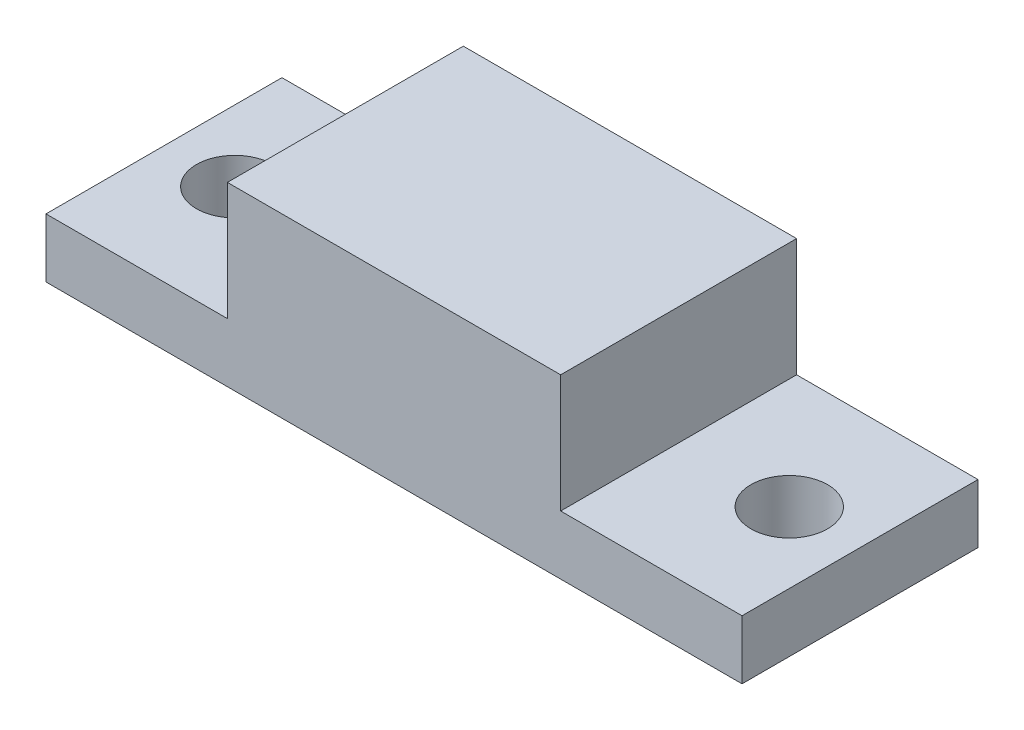
ISO-10303-21;
HEADER;
FILE_DESCRIPTION(('STEP AP214'),'2;1');
FILE_NAME('part.step','',(''),(''),'','','');
FILE_SCHEMA(('AUTOMOTIVE_DESIGN { 1 0 10303 214 1 1 1 1 }'));
ENDSEC;
DATA;
#1=APPLICATION_CONTEXT('core data for automotive mechanical design processes');
#2=APPLICATION_PROTOCOL_DEFINITION('international standard','automotive_design',2000,#1);
#3=PRODUCT_CONTEXT('',#1,'mechanical');
#4=PRODUCT('Part','Part','',(#3));
#5=PRODUCT_RELATED_PRODUCT_CATEGORY('part','',(#4));
#6=PRODUCT_DEFINITION_FORMATION('','',#4);
#7=PRODUCT_DEFINITION_CONTEXT('part definition',#1,'design');
#8=PRODUCT_DEFINITION('design','',#6,#7);
#9=PRODUCT_DEFINITION_SHAPE('','',#8);
#10=(LENGTH_UNIT() NAMED_UNIT(*) SI_UNIT(.MILLI.,.METRE.));
#11=(NAMED_UNIT(*) PLANE_ANGLE_UNIT() SI_UNIT($,.RADIAN.));
#12=(NAMED_UNIT(*) SI_UNIT($,.STERADIAN.) SOLID_ANGLE_UNIT());
#13=UNCERTAINTY_MEASURE_WITH_UNIT(LENGTH_MEASURE(1.E-05),#10,'distance_accuracy_value','');
#14=(GEOMETRIC_REPRESENTATION_CONTEXT(3) GLOBAL_UNCERTAINTY_ASSIGNED_CONTEXT((#13)) GLOBAL_UNIT_ASSIGNED_CONTEXT((#10,
#11,#12)) REPRESENTATION_CONTEXT('',''));
#15=CARTESIAN_POINT('',(0.,0.,0.));
#16=DIRECTION('',(0.,0.,1.));
#17=DIRECTION('',(1.,0.,0.));
#18=AXIS2_PLACEMENT_3D('',#15,#16,#17);
#19=CARTESIAN_POINT('',(-5.65,-4.,8.));
#20=DIRECTION('',(1.,0.,0.));
#21=DIRECTION('',(0.,0.,-1.));
#22=AXIS2_PLACEMENT_3D('',#19,#20,#21);
#23=PLANE('',#22);
#24=DIRECTION('',(0.,-1.,0.));
#25=VECTOR('',#24,1.);
#26=CARTESIAN_POINT('',(-5.65,-4.,0.));
#27=LINE('',#26,#25);
#28=CARTESIAN_POINT('',(-5.65,0.,0.));
#29=VERTEX_POINT('',#28);
#30=CARTESIAN_POINT('',(-5.65,-4.,0.));
#31=VERTEX_POINT('',#30);
#32=EDGE_CURVE('E131',#29,#31,#27,.T.);
#33=ORIENTED_EDGE('',*,*,#32,.T.);
#34=DIRECTION('',(0.,0.,-1.));
#35=VECTOR('',#34,1.);
#36=CARTESIAN_POINT('',(-5.65,-4.,8.));
#37=LINE('',#36,#35);
#38=CARTESIAN_POINT('',(-5.65,-4.,8.));
#39=VERTEX_POINT('',#38);
#40=EDGE_CURVE('E11',#39,#31,#37,.T.);
#41=ORIENTED_EDGE('',*,*,#40,.F.);
#42=DIRECTION('',(0.,-1.,0.));
#43=VECTOR('',#42,1.);
#44=CARTESIAN_POINT('',(-5.65,-4.,8.));
#45=LINE('',#44,#43);
#46=CARTESIAN_POINT('',(-5.65,0.,8.));
#47=VERTEX_POINT('',#46);
#48=EDGE_CURVE('E146',#47,#39,#45,.T.);
#49=ORIENTED_EDGE('',*,*,#48,.F.);
#50=DIRECTION('',(0.,0.,-1.));
#51=VECTOR('',#50,1.);
#52=CARTESIAN_POINT('',(-5.65,0.,8.));
#53=LINE('',#52,#51);
#54=EDGE_CURVE('E127',#47,#29,#53,.T.);
#55=ORIENTED_EDGE('',*,*,#54,.T.);
#56=EDGE_LOOP('',(#33,#41,#49,#55));
#57=FACE_BOUND('',#56,.T.);
#58=ADVANCED_FACE('F35',(#57),#23,.F.);
#59=CARTESIAN_POINT('',(-11.8,-4.,8.));
#60=DIRECTION('',(0.,-1.,0.));
#61=DIRECTION('',(0.,0.,-1.));
#62=AXIS2_PLACEMENT_3D('',#59,#60,#61);
#63=PLANE('',#62);
#64=CARTESIAN_POINT('',(-9.4,-4.,4.));
#65=DIRECTION('',(0.,-1.,0.));
#66=DIRECTION('',(0.,0.,-1.));
#67=AXIS2_PLACEMENT_3D('',#64,#65,#66);
#68=CIRCLE('',#67,1.3);
#69=CARTESIAN_POINT('',(-9.4,-4.,2.7));
#70=VERTEX_POINT('',#69);
#71=EDGE_CURVE('E135',#70,#70,#68,.F.);
#72=ORIENTED_EDGE('',*,*,#71,.F.);
#73=EDGE_LOOP('',(#72));
#74=FACE_BOUND('',#73,.T.);
#75=DIRECTION('',(-1.,0.,0.));
#76=VECTOR('',#75,1.);
#77=CARTESIAN_POINT('',(-11.8,-4.,0.));
#78=LINE('',#77,#76);
#79=CARTESIAN_POINT('',(-11.8,-4.,0.));
#80=VERTEX_POINT('',#79);
#81=EDGE_CURVE('E134',#31,#80,#78,.T.);
#82=ORIENTED_EDGE('',*,*,#81,.T.);
#83=DIRECTION('',(0.,0.,-1.));
#84=VECTOR('',#83,1.);
#85=CARTESIAN_POINT('',(-11.8,-4.,8.));
#86=LINE('',#85,#84);
#87=CARTESIAN_POINT('',(-11.8,-4.,8.));
#88=VERTEX_POINT('',#87);
#89=EDGE_CURVE('E43',#88,#80,#86,.T.);
#90=ORIENTED_EDGE('',*,*,#89,.F.);
#91=DIRECTION('',(-1.,0.,0.));
#92=VECTOR('',#91,1.);
#93=CARTESIAN_POINT('',(-11.8,-4.,8.));
#94=LINE('',#93,#92);
#95=EDGE_CURVE('E94',#39,#88,#94,.T.);
#96=ORIENTED_EDGE('',*,*,#95,.F.);
#97=ORIENTED_EDGE('',*,*,#40,.T.);
#98=EDGE_LOOP('',(#82,#90,#96,#97));
#99=FACE_BOUND('',#98,.T.);
#100=ADVANCED_FACE('F215',(#74,#99),#63,.F.);
#101=CARTESIAN_POINT('',(-11.8,-6.,8.));
#102=DIRECTION('',(1.,0.,0.));
#103=DIRECTION('',(0.,0.,-1.));
#104=AXIS2_PLACEMENT_3D('',#101,#102,#103);
#105=PLANE('',#104);
#106=DIRECTION('',(0.,-1.,0.));
#107=VECTOR('',#106,1.);
#108=CARTESIAN_POINT('',(-11.8,-6.,0.));
#109=LINE('',#108,#107);
#110=CARTESIAN_POINT('',(-11.8,-6.,0.));
#111=VERTEX_POINT('',#110);
#112=EDGE_CURVE('E137',#80,#111,#109,.T.);
#113=ORIENTED_EDGE('',*,*,#112,.T.);
#114=DIRECTION('',(0.,0.,-1.));
#115=VECTOR('',#114,1.);
#116=CARTESIAN_POINT('',(-11.8,-6.,8.));
#117=LINE('',#116,#115);
#118=CARTESIAN_POINT('',(-11.8,-6.,8.));
#119=VERTEX_POINT('',#118);
#120=EDGE_CURVE('E153',#119,#111,#117,.T.);
#121=ORIENTED_EDGE('',*,*,#120,.F.);
#122=DIRECTION('',(0.,-1.,0.));
#123=VECTOR('',#122,1.);
#124=CARTESIAN_POINT('',(-11.8,-6.,8.));
#125=LINE('',#124,#123);
#126=EDGE_CURVE('E161',#88,#119,#125,.T.);
#127=ORIENTED_EDGE('',*,*,#126,.F.);
#128=ORIENTED_EDGE('',*,*,#89,.T.);
#129=EDGE_LOOP('',(#113,#121,#127,#128));
#130=FACE_BOUND('',#129,.T.);
#131=ADVANCED_FACE('F159',(#130),#105,.F.);
#132=CARTESIAN_POINT('',(11.8,-6.,8.));
#133=DIRECTION('',(0.,1.,0.));
#134=DIRECTION('',(0.,0.,1.));
#135=AXIS2_PLACEMENT_3D('',#132,#133,#134);
#136=PLANE('',#135);
#137=CARTESIAN_POINT('',(-9.4,-6.,4.));
#138=DIRECTION('',(0.,-1.,0.));
#139=DIRECTION('',(0.,0.,-1.));
#140=AXIS2_PLACEMENT_3D('',#137,#138,#139);
#141=CIRCLE('',#140,1.3);
#142=CARTESIAN_POINT('',(-9.4,-6.,2.7));
#143=VERTEX_POINT('',#142);
#144=EDGE_CURVE('E182',#143,#143,#141,.T.);
#145=ORIENTED_EDGE('',*,*,#144,.F.);
#146=EDGE_LOOP('',(#145));
#147=FACE_BOUND('',#146,.T.);
#148=CARTESIAN_POINT('',(9.4,-6.,4.));
#149=DIRECTION('',(0.,-1.,0.));
#150=DIRECTION('',(0.,0.,-1.));
#151=AXIS2_PLACEMENT_3D('',#148,#149,#150);
#152=CIRCLE('',#151,1.3);
#153=CARTESIAN_POINT('',(9.4,-6.,2.7));
#154=VERTEX_POINT('',#153);
#155=EDGE_CURVE('E183',#154,#154,#152,.T.);
#156=ORIENTED_EDGE('',*,*,#155,.F.);
#157=EDGE_LOOP('',(#156));
#158=FACE_BOUND('',#157,.T.);
#159=DIRECTION('',(1.,0.,0.));
#160=VECTOR('',#159,1.);
#161=CARTESIAN_POINT('',(11.8,-6.,0.));
#162=LINE('',#161,#160);
#163=CARTESIAN_POINT('',(11.8,-6.,0.));
#164=VERTEX_POINT('',#163);
#165=EDGE_CURVE('E139',#111,#164,#162,.T.);
#166=ORIENTED_EDGE('',*,*,#165,.T.);
#167=DIRECTION('',(0.,0.,-1.));
#168=VECTOR('',#167,1.);
#169=CARTESIAN_POINT('',(11.8,-6.,8.));
#170=LINE('',#169,#168);
#171=CARTESIAN_POINT('',(11.8,-6.,8.));
#172=VERTEX_POINT('',#171);
#173=EDGE_CURVE('E150',#172,#164,#170,.T.);
#174=ORIENTED_EDGE('',*,*,#173,.F.);
#175=DIRECTION('',(1.,0.,0.));
#176=VECTOR('',#175,1.);
#177=CARTESIAN_POINT('',(11.8,-6.,8.));
#178=LINE('',#177,#176);
#179=EDGE_CURVE('E173',#119,#172,#178,.T.);
#180=ORIENTED_EDGE('',*,*,#179,.F.);
#181=ORIENTED_EDGE('',*,*,#120,.T.);
#182=EDGE_LOOP('',(#166,#174,#180,#181));
#183=FACE_BOUND('',#182,.T.);
#184=ADVANCED_FACE('F169',(#147,#158,#183),#136,.F.);
#185=CARTESIAN_POINT('',(11.8,-4.,8.));
#186=DIRECTION('',(-1.,0.,0.));
#187=DIRECTION('',(0.,0.,1.));
#188=AXIS2_PLACEMENT_3D('',#185,#186,#187);
#189=PLANE('',#188);
#190=DIRECTION('',(0.,1.,0.));
#191=VECTOR('',#190,1.);
#192=CARTESIAN_POINT('',(11.8,-4.,0.));
#193=LINE('',#192,#191);
#194=CARTESIAN_POINT('',(11.8,-4.,0.));
#195=VERTEX_POINT('',#194);
#196=EDGE_CURVE('E141',#164,#195,#193,.T.);
#197=ORIENTED_EDGE('',*,*,#196,.T.);
#198=DIRECTION('',(0.,0.,-1.));
#199=VECTOR('',#198,1.);
#200=CARTESIAN_POINT('',(11.8,-4.,8.));
#201=LINE('',#200,#199);
#202=CARTESIAN_POINT('',(11.8,-4.,8.));
#203=VERTEX_POINT('',#202);
#204=EDGE_CURVE('E122',#203,#195,#201,.T.);
#205=ORIENTED_EDGE('',*,*,#204,.F.);
#206=DIRECTION('',(0.,1.,0.));
#207=VECTOR('',#206,1.);
#208=CARTESIAN_POINT('',(11.8,-4.,8.));
#209=LINE('',#208,#207);
#210=EDGE_CURVE('E113',#172,#203,#209,.T.);
#211=ORIENTED_EDGE('',*,*,#210,.F.);
#212=ORIENTED_EDGE('',*,*,#173,.T.);
#213=EDGE_LOOP('',(#197,#205,#211,#212));
#214=FACE_BOUND('',#213,.T.);
#215=ADVANCED_FACE('F172',(#214),#189,.F.);
#216=CARTESIAN_POINT('',(5.65,-4.,8.));
#217=DIRECTION('',(0.,-1.,0.));
#218=DIRECTION('',(0.,0.,-1.));
#219=AXIS2_PLACEMENT_3D('',#216,#217,#218);
#220=PLANE('',#219);
#221=CARTESIAN_POINT('',(9.4,-4.,4.));
#222=DIRECTION('',(0.,-1.,0.));
#223=DIRECTION('',(0.,0.,-1.));
#224=AXIS2_PLACEMENT_3D('',#221,#222,#223);
#225=CIRCLE('',#224,1.3);
#226=CARTESIAN_POINT('',(9.4,-4.,2.7));
#227=VERTEX_POINT('',#226);
#228=EDGE_CURVE('E179',#227,#227,#225,.F.);
#229=ORIENTED_EDGE('',*,*,#228,.F.);
#230=EDGE_LOOP('',(#229));
#231=FACE_BOUND('',#230,.T.);
#232=DIRECTION('',(-1.,0.,0.));
#233=VECTOR('',#232,1.);
#234=CARTESIAN_POINT('',(5.65,-4.,0.));
#235=LINE('',#234,#233);
#236=CARTESIAN_POINT('',(5.65,-4.,0.));
#237=VERTEX_POINT('',#236);
#238=EDGE_CURVE('E121',#195,#237,#235,.T.);
#239=ORIENTED_EDGE('',*,*,#238,.T.);
#240=DIRECTION('',(0.,0.,-1.));
#241=VECTOR('',#240,1.);
#242=CARTESIAN_POINT('',(5.65,-4.,8.));
#243=LINE('',#242,#241);
#244=CARTESIAN_POINT('',(5.65,-4.,8.));
#245=VERTEX_POINT('',#244);
#246=EDGE_CURVE('E118',#245,#237,#243,.T.);
#247=ORIENTED_EDGE('',*,*,#246,.F.);
#248=DIRECTION('',(-1.,0.,0.));
#249=VECTOR('',#248,1.);
#250=CARTESIAN_POINT('',(5.65,-4.,8.));
#251=LINE('',#250,#249);
#252=EDGE_CURVE('E107',#203,#245,#251,.T.);
#253=ORIENTED_EDGE('',*,*,#252,.F.);
#254=ORIENTED_EDGE('',*,*,#204,.T.);
#255=EDGE_LOOP('',(#239,#247,#253,#254));
#256=FACE_BOUND('',#255,.T.);
#257=ADVANCED_FACE('F119',(#231,#256),#220,.F.);
#258=CARTESIAN_POINT('',(5.65,0.,8.));
#259=DIRECTION('',(-1.,0.,0.));
#260=DIRECTION('',(0.,0.,1.));
#261=AXIS2_PLACEMENT_3D('',#258,#259,#260);
#262=PLANE('',#261);
#263=DIRECTION('',(0.,1.,0.));
#264=VECTOR('',#263,1.);
#265=CARTESIAN_POINT('',(5.65,0.,0.));
#266=LINE('',#265,#264);
#267=CARTESIAN_POINT('',(5.65,0.,0.));
#268=VERTEX_POINT('',#267);
#269=EDGE_CURVE('E80',#237,#268,#266,.T.);
#270=ORIENTED_EDGE('',*,*,#269,.T.);
#271=DIRECTION('',(0.,0.,-1.));
#272=VECTOR('',#271,1.);
#273=CARTESIAN_POINT('',(5.65,0.,8.));
#274=LINE('',#273,#272);
#275=CARTESIAN_POINT('',(5.65,0.,8.));
#276=VERTEX_POINT('',#275);
#277=EDGE_CURVE('E123',#276,#268,#274,.T.);
#278=ORIENTED_EDGE('',*,*,#277,.F.);
#279=DIRECTION('',(0.,1.,0.));
#280=VECTOR('',#279,1.);
#281=CARTESIAN_POINT('',(5.65,0.,8.));
#282=LINE('',#281,#280);
#283=EDGE_CURVE('E111',#245,#276,#282,.T.);
#284=ORIENTED_EDGE('',*,*,#283,.F.);
#285=ORIENTED_EDGE('',*,*,#246,.T.);
#286=EDGE_LOOP('',(#270,#278,#284,#285));
#287=FACE_BOUND('',#286,.T.);
#288=ADVANCED_FACE('F125',(#287),#262,.F.);
#289=CARTESIAN_POINT('',(-5.65,0.,8.));
#290=DIRECTION('',(0.,-1.,0.));
#291=DIRECTION('',(0.,0.,-1.));
#292=AXIS2_PLACEMENT_3D('',#289,#290,#291);
#293=PLANE('',#292);
#294=DIRECTION('',(-1.,0.,0.));
#295=VECTOR('',#294,1.);
#296=CARTESIAN_POINT('',(-5.65,0.,0.));
#297=LINE('',#296,#295);
#298=EDGE_CURVE('E86',#268,#29,#297,.T.);
#299=ORIENTED_EDGE('',*,*,#298,.T.);
#300=ORIENTED_EDGE('',*,*,#54,.F.);
#301=DIRECTION('',(-1.,0.,0.));
#302=VECTOR('',#301,1.);
#303=CARTESIAN_POINT('',(-5.65,0.,8.));
#304=LINE('',#303,#302);
#305=EDGE_CURVE('E51',#276,#47,#304,.T.);
#306=ORIENTED_EDGE('',*,*,#305,.F.);
#307=ORIENTED_EDGE('',*,*,#277,.T.);
#308=EDGE_LOOP('',(#299,#300,#306,#307));
#309=FACE_BOUND('',#308,.T.);
#310=ADVANCED_FACE('F211',(#309),#293,.F.);
#311=CARTESIAN_POINT('',(0.,0.,8.));
#312=DIRECTION('',(0.,0.,-1.));
#313=DIRECTION('',(-1.,0.,0.));
#314=AXIS2_PLACEMENT_3D('',#311,#312,#313);
#315=PLANE('',#314);
#316=ORIENTED_EDGE('',*,*,#48,.T.);
#317=ORIENTED_EDGE('',*,*,#95,.T.);
#318=ORIENTED_EDGE('',*,*,#126,.T.);
#319=ORIENTED_EDGE('',*,*,#179,.T.);
#320=ORIENTED_EDGE('',*,*,#210,.T.);
#321=ORIENTED_EDGE('',*,*,#252,.T.);
#322=ORIENTED_EDGE('',*,*,#283,.T.);
#323=ORIENTED_EDGE('',*,*,#305,.T.);
#324=EDGE_LOOP('',(#316,#317,#318,#319,#320,#321,#322,#323));
#325=FACE_BOUND('',#324,.T.);
#326=ADVANCED_FACE('F109',(#325),#315,.F.);
#327=CARTESIAN_POINT('',(0.,0.,0.));
#328=DIRECTION('',(0.,0.,-1.));
#329=DIRECTION('',(-1.,0.,0.));
#330=AXIS2_PLACEMENT_3D('',#327,#328,#329);
#331=PLANE('',#330);
#332=ORIENTED_EDGE('',*,*,#32,.F.);
#333=ORIENTED_EDGE('',*,*,#298,.F.);
#334=ORIENTED_EDGE('',*,*,#269,.F.);
#335=ORIENTED_EDGE('',*,*,#238,.F.);
#336=ORIENTED_EDGE('',*,*,#196,.F.);
#337=ORIENTED_EDGE('',*,*,#165,.F.);
#338=ORIENTED_EDGE('',*,*,#112,.F.);
#339=ORIENTED_EDGE('',*,*,#81,.F.);
#340=EDGE_LOOP('',(#332,#333,#334,#335,#336,#337,#338,#339));
#341=FACE_BOUND('',#340,.T.);
#342=ADVANCED_FACE('F165',(#341),#331,.T.);
#343=CARTESIAN_POINT('',(9.4,0.00100000000000013,4.));
#344=DIRECTION('',(0.,-1.,0.));
#345=DIRECTION('',(0.,0.,-1.));
#346=AXIS2_PLACEMENT_3D('',#343,#344,#345);
#347=CYLINDRICAL_SURFACE('',#346,1.3);
#348=CARTESIAN_POINT('',(9.4,-6.,2.7));
#349=CARTESIAN_POINT('',(9.4,-5.97916666666667,2.7));
#350=CARTESIAN_POINT('',(9.4,-5.95833333333333,2.7));
#351=CARTESIAN_POINT('',(9.4,-5.91666666666667,2.7));
#352=CARTESIAN_POINT('',(9.4,-5.89583333333333,2.7));
#353=CARTESIAN_POINT('',(9.4,-5.85416666666667,2.7));
#354=CARTESIAN_POINT('',(9.4,-5.83333333333333,2.7));
#355=CARTESIAN_POINT('',(9.4,-5.79166666666667,2.7));
#356=CARTESIAN_POINT('',(9.4,-5.77083333333333,2.7));
#357=CARTESIAN_POINT('',(9.4,-5.72916666666667,2.7));
#358=CARTESIAN_POINT('',(9.4,-5.70833333333333,2.7));
#359=CARTESIAN_POINT('',(9.4,-5.66666666666667,2.7));
#360=CARTESIAN_POINT('',(9.4,-5.64583333333333,2.7));
#361=CARTESIAN_POINT('',(9.4,-5.60416666666667,2.7));
#362=CARTESIAN_POINT('',(9.4,-5.58333333333333,2.7));
#363=CARTESIAN_POINT('',(9.4,-5.54166666666667,2.7));
#364=CARTESIAN_POINT('',(9.4,-5.52083333333333,2.7));
#365=CARTESIAN_POINT('',(9.4,-5.47916666666667,2.7));
#366=CARTESIAN_POINT('',(9.4,-5.45833333333333,2.7));
#367=CARTESIAN_POINT('',(9.4,-5.41666666666667,2.7));
#368=CARTESIAN_POINT('',(9.4,-5.39583333333333,2.7));
#369=CARTESIAN_POINT('',(9.4,-5.35416666666667,2.7));
#370=CARTESIAN_POINT('',(9.4,-5.33333333333333,2.7));
#371=CARTESIAN_POINT('',(9.4,-5.29166666666667,2.7));
#372=CARTESIAN_POINT('',(9.4,-5.27083333333333,2.7));
#373=CARTESIAN_POINT('',(9.4,-5.22916666666667,2.7));
#374=CARTESIAN_POINT('',(9.4,-5.20833333333333,2.7));
#375=CARTESIAN_POINT('',(9.4,-5.16666666666667,2.7));
#376=CARTESIAN_POINT('',(9.4,-5.14583333333333,2.7));
#377=CARTESIAN_POINT('',(9.4,-5.10416666666667,2.7));
#378=CARTESIAN_POINT('',(9.4,-5.08333333333333,2.7));
#379=CARTESIAN_POINT('',(9.4,-5.04166666666667,2.7));
#380=CARTESIAN_POINT('',(9.4,-5.02083333333333,2.7));
#381=CARTESIAN_POINT('',(9.4,-4.97916666666667,2.7));
#382=CARTESIAN_POINT('',(9.4,-4.95833333333333,2.7));
#383=CARTESIAN_POINT('',(9.4,-4.91666666666667,2.7));
#384=CARTESIAN_POINT('',(9.4,-4.89583333333333,2.7));
#385=CARTESIAN_POINT('',(9.4,-4.85416666666667,2.7));
#386=CARTESIAN_POINT('',(9.4,-4.83333333333333,2.7));
#387=CARTESIAN_POINT('',(9.4,-4.79166666666667,2.7));
#388=CARTESIAN_POINT('',(9.4,-4.77083333333333,2.7));
#389=CARTESIAN_POINT('',(9.4,-4.72916666666667,2.7));
#390=CARTESIAN_POINT('',(9.4,-4.70833333333333,2.7));
#391=CARTESIAN_POINT('',(9.4,-4.66666666666667,2.7));
#392=CARTESIAN_POINT('',(9.4,-4.64583333333333,2.7));
#393=CARTESIAN_POINT('',(9.4,-4.60416666666667,2.7));
#394=CARTESIAN_POINT('',(9.4,-4.58333333333333,2.7));
#395=CARTESIAN_POINT('',(9.4,-4.54166666666667,2.7));
#396=CARTESIAN_POINT('',(9.4,-4.52083333333333,2.7));
#397=CARTESIAN_POINT('',(9.4,-4.47916666666667,2.7));
#398=CARTESIAN_POINT('',(9.4,-4.45833333333333,2.7));
#399=CARTESIAN_POINT('',(9.4,-4.41666666666667,2.7));
#400=CARTESIAN_POINT('',(9.4,-4.39583333333333,2.7));
#401=CARTESIAN_POINT('',(9.4,-4.35416666666667,2.7));
#402=CARTESIAN_POINT('',(9.4,-4.33333333333333,2.7));
#403=CARTESIAN_POINT('',(9.4,-4.29166666666667,2.7));
#404=CARTESIAN_POINT('',(9.4,-4.27083333333333,2.7));
#405=CARTESIAN_POINT('',(9.4,-4.22916666666667,2.7));
#406=CARTESIAN_POINT('',(9.4,-4.20833333333333,2.7));
#407=CARTESIAN_POINT('',(9.4,-4.16666666666667,2.7));
#408=CARTESIAN_POINT('',(9.4,-4.14583333333333,2.7));
#409=CARTESIAN_POINT('',(9.4,-4.10416666666667,2.7));
#410=CARTESIAN_POINT('',(9.4,-4.08333333333333,2.7));
#411=CARTESIAN_POINT('',(9.4,-4.04166666666667,2.7));
#412=CARTESIAN_POINT('',(9.4,-4.02083333333333,2.7));
#413=CARTESIAN_POINT('',(9.4,-4.,2.7));
#414=B_SPLINE_CURVE_WITH_KNOTS('',3,(#348,#349,#350,#351,#352,#353,#354,#355,#356,#357,#358,
#359,#360,#361,#362,#363,#364,#365,#366,#367,#368,#369,#370,#371,#372,#373,#374,#375,#376,#377,
#378,#379,#380,#381,#382,#383,#384,#385,#386,#387,#388,#389,#390,#391,#392,#393,#394,#395,#396,
#397,#398,#399,#400,#401,#402,#403,#404,#405,#406,#407,#408,#409,#410,#411,#412,#413),
.UNSPECIFIED.,.F.,.F.,(4,2,2,2,2,2,2,2,2,2,2,2,2,2,2,2,2,2,2,2,2,2,2,2,2,2,2,2,2,2,2,2,4),(0.,
0.0625000000000001,0.125,0.1875,0.25,0.3125,0.375,0.4375,0.5,0.5625,0.625,0.6875,0.75,0.8125,
0.875,0.9375,1.,1.0625,1.125,1.1875,1.25,1.3125,1.375,1.4375,1.5,1.5625,1.625,1.6875,1.75,
1.8125,1.875,1.9375,2.),.UNSPECIFIED.);
#415=EDGE_CURVE('BSEAM199',#154,#227,#414,.T.);
#416=ORIENTED_EDGE('',*,*,#155,.T.);
#417=ORIENTED_EDGE('',*,*,#228,.T.);
#418=ORIENTED_EDGE('',*,*,#415,.T.);
#419=ORIENTED_EDGE('',*,*,#415,.F.);
#420=EDGE_LOOP('',(#416,#418,#417,#419));
#421=FACE_BOUND('',#420,.T.);
#422=ADVANCED_FACE('F199',(#421),#347,.F.);
#423=CARTESIAN_POINT('',(-9.4,0.00100000000000013,4.));
#424=DIRECTION('',(0.,-1.,0.));
#425=DIRECTION('',(0.,0.,-1.));
#426=AXIS2_PLACEMENT_3D('',#423,#424,#425);
#427=CYLINDRICAL_SURFACE('',#426,1.3);
#428=CARTESIAN_POINT('',(-9.4,-6.,2.7));
#429=CARTESIAN_POINT('',(-9.4,-5.97916666666667,2.7));
#430=CARTESIAN_POINT('',(-9.4,-5.95833333333333,2.7));
#431=CARTESIAN_POINT('',(-9.4,-5.91666666666667,2.7));
#432=CARTESIAN_POINT('',(-9.4,-5.89583333333333,2.7));
#433=CARTESIAN_POINT('',(-9.4,-5.85416666666667,2.7));
#434=CARTESIAN_POINT('',(-9.4,-5.83333333333333,2.7));
#435=CARTESIAN_POINT('',(-9.4,-5.79166666666667,2.7));
#436=CARTESIAN_POINT('',(-9.4,-5.77083333333333,2.7));
#437=CARTESIAN_POINT('',(-9.4,-5.72916666666667,2.7));
#438=CARTESIAN_POINT('',(-9.4,-5.70833333333333,2.7));
#439=CARTESIAN_POINT('',(-9.4,-5.66666666666667,2.7));
#440=CARTESIAN_POINT('',(-9.4,-5.64583333333333,2.7));
#441=CARTESIAN_POINT('',(-9.4,-5.60416666666667,2.7));
#442=CARTESIAN_POINT('',(-9.4,-5.58333333333333,2.7));
#443=CARTESIAN_POINT('',(-9.4,-5.54166666666667,2.7));
#444=CARTESIAN_POINT('',(-9.4,-5.52083333333333,2.7));
#445=CARTESIAN_POINT('',(-9.4,-5.47916666666667,2.7));
#446=CARTESIAN_POINT('',(-9.4,-5.45833333333333,2.7));
#447=CARTESIAN_POINT('',(-9.4,-5.41666666666667,2.7));
#448=CARTESIAN_POINT('',(-9.4,-5.39583333333333,2.7));
#449=CARTESIAN_POINT('',(-9.4,-5.35416666666667,2.7));
#450=CARTESIAN_POINT('',(-9.4,-5.33333333333333,2.7));
#451=CARTESIAN_POINT('',(-9.4,-5.29166666666667,2.7));
#452=CARTESIAN_POINT('',(-9.4,-5.27083333333333,2.7));
#453=CARTESIAN_POINT('',(-9.4,-5.22916666666667,2.7));
#454=CARTESIAN_POINT('',(-9.4,-5.20833333333333,2.7));
#455=CARTESIAN_POINT('',(-9.4,-5.16666666666667,2.7));
#456=CARTESIAN_POINT('',(-9.4,-5.14583333333333,2.7));
#457=CARTESIAN_POINT('',(-9.4,-5.10416666666667,2.7));
#458=CARTESIAN_POINT('',(-9.4,-5.08333333333333,2.7));
#459=CARTESIAN_POINT('',(-9.4,-5.04166666666667,2.7));
#460=CARTESIAN_POINT('',(-9.4,-5.02083333333333,2.7));
#461=CARTESIAN_POINT('',(-9.4,-4.97916666666667,2.7));
#462=CARTESIAN_POINT('',(-9.4,-4.95833333333333,2.7));
#463=CARTESIAN_POINT('',(-9.4,-4.91666666666667,2.7));
#464=CARTESIAN_POINT('',(-9.4,-4.89583333333333,2.7));
#465=CARTESIAN_POINT('',(-9.4,-4.85416666666667,2.7));
#466=CARTESIAN_POINT('',(-9.4,-4.83333333333333,2.7));
#467=CARTESIAN_POINT('',(-9.4,-4.79166666666667,2.7));
#468=CARTESIAN_POINT('',(-9.4,-4.77083333333333,2.7));
#469=CARTESIAN_POINT('',(-9.4,-4.72916666666667,2.7));
#470=CARTESIAN_POINT('',(-9.4,-4.70833333333333,2.7));
#471=CARTESIAN_POINT('',(-9.4,-4.66666666666667,2.7));
#472=CARTESIAN_POINT('',(-9.4,-4.64583333333333,2.7));
#473=CARTESIAN_POINT('',(-9.4,-4.60416666666667,2.7));
#474=CARTESIAN_POINT('',(-9.4,-4.58333333333333,2.7));
#475=CARTESIAN_POINT('',(-9.4,-4.54166666666667,2.7));
#476=CARTESIAN_POINT('',(-9.4,-4.52083333333333,2.7));
#477=CARTESIAN_POINT('',(-9.4,-4.47916666666667,2.7));
#478=CARTESIAN_POINT('',(-9.4,-4.45833333333333,2.7));
#479=CARTESIAN_POINT('',(-9.4,-4.41666666666667,2.7));
#480=CARTESIAN_POINT('',(-9.4,-4.39583333333333,2.7));
#481=CARTESIAN_POINT('',(-9.4,-4.35416666666667,2.7));
#482=CARTESIAN_POINT('',(-9.4,-4.33333333333333,2.7));
#483=CARTESIAN_POINT('',(-9.4,-4.29166666666667,2.7));
#484=CARTESIAN_POINT('',(-9.4,-4.27083333333333,2.7));
#485=CARTESIAN_POINT('',(-9.4,-4.22916666666667,2.7));
#486=CARTESIAN_POINT('',(-9.4,-4.20833333333333,2.7));
#487=CARTESIAN_POINT('',(-9.4,-4.16666666666667,2.7));
#488=CARTESIAN_POINT('',(-9.4,-4.14583333333333,2.7));
#489=CARTESIAN_POINT('',(-9.4,-4.10416666666667,2.7));
#490=CARTESIAN_POINT('',(-9.4,-4.08333333333333,2.7));
#491=CARTESIAN_POINT('',(-9.4,-4.04166666666667,2.7));
#492=CARTESIAN_POINT('',(-9.4,-4.02083333333333,2.7));
#493=CARTESIAN_POINT('',(-9.4,-4.,2.7));
#494=B_SPLINE_CURVE_WITH_KNOTS('',3,(#428,#429,#430,#431,#432,#433,#434,#435,#436,#437,#438,
#439,#440,#441,#442,#443,#444,#445,#446,#447,#448,#449,#450,#451,#452,#453,#454,#455,#456,#457,
#458,#459,#460,#461,#462,#463,#464,#465,#466,#467,#468,#469,#470,#471,#472,#473,#474,#475,#476,
#477,#478,#479,#480,#481,#482,#483,#484,#485,#486,#487,#488,#489,#490,#491,#492,#493),
.UNSPECIFIED.,.F.,.F.,(4,2,2,2,2,2,2,2,2,2,2,2,2,2,2,2,2,2,2,2,2,2,2,2,2,2,2,2,2,2,2,2,4),(0.,
0.0625000000000001,0.125,0.1875,0.25,0.3125,0.375,0.4375,0.5,0.5625,0.625,0.6875,0.75,0.8125,
0.875,0.9375,1.,1.0625,1.125,1.1875,1.25,1.3125,1.375,1.4375,1.5,1.5625,1.625,1.6875,1.75,
1.8125,1.875,1.9375,2.),.UNSPECIFIED.);
#495=EDGE_CURVE('BSEAM191',#143,#70,#494,.T.);
#496=ORIENTED_EDGE('',*,*,#144,.T.);
#497=ORIENTED_EDGE('',*,*,#71,.T.);
#498=ORIENTED_EDGE('',*,*,#495,.T.);
#499=ORIENTED_EDGE('',*,*,#495,.F.);
#500=EDGE_LOOP('',(#496,#498,#497,#499));
#501=FACE_BOUND('',#500,.T.);
#502=ADVANCED_FACE('F191',(#501),#427,.F.);
#503=CLOSED_SHELL('',(#58,#100,#131,#184,#215,#257,#288,#310,#326,#342,#422,#502));
#504=MANIFOLD_SOLID_BREP('B2',#503);
#505=ADVANCED_BREP_SHAPE_REPRESENTATION('',(#18,#504),#14);
#506=SHAPE_DEFINITION_REPRESENTATION(#9,#505);
ENDSEC;
END-ISO-10303-21;
